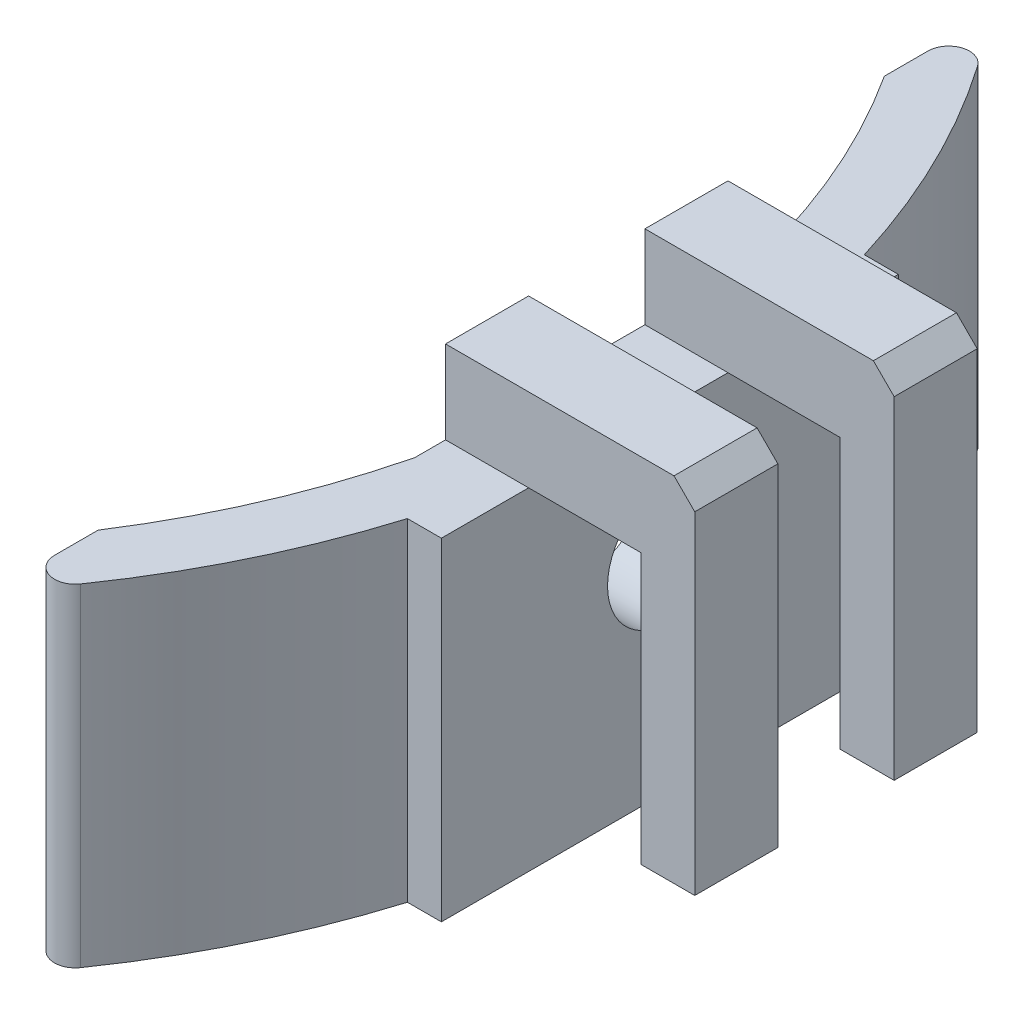
ISO-10303-21;
HEADER;
FILE_DESCRIPTION(('STEP AP214'),'2;1');
FILE_NAME('part.step','',(''),(''),'','','');
FILE_SCHEMA(('AUTOMOTIVE_DESIGN { 1 0 10303 214 1 1 1 1 }'));
ENDSEC;
DATA;
#1=APPLICATION_CONTEXT('core data for automotive mechanical design processes');
#2=APPLICATION_PROTOCOL_DEFINITION('international standard','automotive_design',2000,#1);
#3=PRODUCT_CONTEXT('',#1,'mechanical');
#4=PRODUCT('Part','Part','',(#3));
#5=PRODUCT_RELATED_PRODUCT_CATEGORY('part','',(#4));
#6=PRODUCT_DEFINITION_FORMATION('','',#4);
#7=PRODUCT_DEFINITION_CONTEXT('part definition',#1,'design');
#8=PRODUCT_DEFINITION('design','',#6,#7);
#9=PRODUCT_DEFINITION_SHAPE('','',#8);
#10=(LENGTH_UNIT() NAMED_UNIT(*) SI_UNIT(.MILLI.,.METRE.));
#11=(NAMED_UNIT(*) PLANE_ANGLE_UNIT() SI_UNIT($,.RADIAN.));
#12=(NAMED_UNIT(*) SI_UNIT($,.STERADIAN.) SOLID_ANGLE_UNIT());
#13=UNCERTAINTY_MEASURE_WITH_UNIT(LENGTH_MEASURE(1.E-05),#10,'distance_accuracy_value','');
#14=(GEOMETRIC_REPRESENTATION_CONTEXT(3) GLOBAL_UNCERTAINTY_ASSIGNED_CONTEXT((#13)) GLOBAL_UNIT_ASSIGNED_CONTEXT((#10,
#11,#12)) REPRESENTATION_CONTEXT('',''));
#15=CARTESIAN_POINT('',(0.,0.,0.));
#16=DIRECTION('',(0.,0.,1.));
#17=DIRECTION('',(1.,0.,0.));
#18=AXIS2_PLACEMENT_3D('',#15,#16,#17);
#19=CARTESIAN_POINT('',(2.,-3.,5.5));
#20=DIRECTION('',(0.,0.,-1.));
#21=DIRECTION('',(-1.,0.,0.));
#22=AXIS2_PLACEMENT_3D('',#19,#20,#21);
#23=PLANE('',#22);
#24=DIRECTION('',(0.,-1.,0.));
#25=VECTOR('',#24,1.);
#26=CARTESIAN_POINT('',(1.18177219531319,3.,5.5));
#27=LINE('',#26,#25);
#28=CARTESIAN_POINT('',(1.18177219531319,-5.,5.5));
#29=VERTEX_POINT('',#28);
#30=CARTESIAN_POINT('',(1.18177219531319,3.,5.5));
#31=VERTEX_POINT('',#30);
#32=EDGE_CURVE('E290',#29,#31,#27,.F.);
#33=ORIENTED_EDGE('',*,*,#32,.F.);
#34=DIRECTION('',(-1.,0.,0.));
#35=VECTOR('',#34,1.);
#36=CARTESIAN_POINT('',(2.,-5.,5.5));
#37=LINE('',#36,#35);
#38=CARTESIAN_POINT('',(2.,-5.,5.5));
#39=VERTEX_POINT('',#38);
#40=EDGE_CURVE('E300',#39,#29,#37,.T.);
#41=ORIENTED_EDGE('',*,*,#40,.F.);
#42=DIRECTION('',(0.,-1.,0.));
#43=VECTOR('',#42,1.);
#44=CARTESIAN_POINT('',(2.,-3.,5.5));
#45=LINE('',#44,#43);
#46=CARTESIAN_POINT('',(2.,3.,5.5));
#47=VERTEX_POINT('',#46);
#48=EDGE_CURVE('E376',#47,#39,#45,.T.);
#49=ORIENTED_EDGE('',*,*,#48,.F.);
#50=DIRECTION('',(-1.,0.,0.));
#51=VECTOR('',#50,1.);
#52=CARTESIAN_POINT('',(2.,3.,5.5));
#53=LINE('',#52,#51);
#54=EDGE_CURVE('E409',#47,#31,#53,.T.);
#55=ORIENTED_EDGE('',*,*,#54,.T.);
#56=EDGE_LOOP('',(#33,#41,#49,#55));
#57=FACE_BOUND('',#56,.T.);
#58=ADVANCED_FACE('F37',(#57),#23,.F.);
#59=CARTESIAN_POINT('',(2.,-3.,-5.5));
#60=DIRECTION('',(0.,0.,1.));
#61=DIRECTION('',(1.,0.,0.));
#62=AXIS2_PLACEMENT_3D('',#59,#60,#61);
#63=PLANE('',#62);
#64=DIRECTION('',(0.,-1.,0.));
#65=VECTOR('',#64,1.);
#66=CARTESIAN_POINT('',(1.18177219531319,3.,-5.5));
#67=LINE('',#66,#65);
#68=CARTESIAN_POINT('',(1.18177219531319,3.,-5.5));
#69=VERTEX_POINT('',#68);
#70=CARTESIAN_POINT('',(1.18177219531319,-5.,-5.5));
#71=VERTEX_POINT('',#70);
#72=EDGE_CURVE('E288',#69,#71,#67,.T.);
#73=ORIENTED_EDGE('',*,*,#72,.F.);
#74=DIRECTION('',(-1.,0.,0.));
#75=VECTOR('',#74,1.);
#76=CARTESIAN_POINT('',(2.,3.,-5.5));
#77=LINE('',#76,#75);
#78=CARTESIAN_POINT('',(2.,3.,-5.5));
#79=VERTEX_POINT('',#78);
#80=EDGE_CURVE('E381',#79,#69,#77,.T.);
#81=ORIENTED_EDGE('',*,*,#80,.F.);
#82=DIRECTION('',(0.,1.,0.));
#83=VECTOR('',#82,1.);
#84=CARTESIAN_POINT('',(2.,-3.,-5.5));
#85=LINE('',#84,#83);
#86=CARTESIAN_POINT('',(2.,-5.,-5.5));
#87=VERTEX_POINT('',#86);
#88=EDGE_CURVE('E379',#87,#79,#85,.T.);
#89=ORIENTED_EDGE('',*,*,#88,.F.);
#90=DIRECTION('',(1.,0.,0.));
#91=VECTOR('',#90,1.);
#92=CARTESIAN_POINT('',(0.,-5.,-5.5));
#93=LINE('',#92,#91);
#94=EDGE_CURVE('E305',#71,#87,#93,.T.);
#95=ORIENTED_EDGE('',*,*,#94,.F.);
#96=EDGE_LOOP('',(#73,#81,#89,#95));
#97=FACE_BOUND('',#96,.T.);
#98=ADVANCED_FACE('F484',(#97),#63,.F.);
#99=CARTESIAN_POINT('',(6.,3.,-1.4));
#100=DIRECTION('',(0.,1.,0.));
#101=DIRECTION('',(0.,0.,1.));
#102=AXIS2_PLACEMENT_3D('',#99,#100,#101);
#103=PLANE('',#102);
#104=DIRECTION('',(0.,0.,-1.));
#105=VECTOR('',#104,1.);
#106=CARTESIAN_POINT('',(4.7,3.,-1.4));
#107=LINE('',#106,#105);
#108=CARTESIAN_POINT('',(4.7,3.,-1.4));
#109=VERTEX_POINT('',#108);
#110=CARTESIAN_POINT('',(4.7,3.,-3.4));
#111=VERTEX_POINT('',#110);
#112=EDGE_CURVE('E307',#109,#111,#107,.T.);
#113=ORIENTED_EDGE('',*,*,#112,.F.);
#114=DIRECTION('',(-1.,0.,0.));
#115=VECTOR('',#114,1.);
#116=CARTESIAN_POINT('',(6.,3.,-1.4));
#117=LINE('',#116,#115);
#118=CARTESIAN_POINT('',(2.,3.,-1.4));
#119=VERTEX_POINT('',#118);
#120=EDGE_CURVE('E365',#109,#119,#117,.T.);
#121=ORIENTED_EDGE('',*,*,#120,.T.);
#122=DIRECTION('',(0.,0.,-1.));
#123=VECTOR('',#122,1.);
#124=CARTESIAN_POINT('',(2.,3.,-1.4));
#125=LINE('',#124,#123);
#126=CARTESIAN_POINT('',(2.,3.,-3.4));
#127=VERTEX_POINT('',#126);
#128=EDGE_CURVE('E355',#119,#127,#125,.T.);
#129=ORIENTED_EDGE('',*,*,#128,.T.);
#130=DIRECTION('',(-1.,0.,0.));
#131=VECTOR('',#130,1.);
#132=CARTESIAN_POINT('',(6.,3.,-3.4));
#133=LINE('',#132,#131);
#134=EDGE_CURVE('E361',#111,#127,#133,.T.);
#135=ORIENTED_EDGE('',*,*,#134,.F.);
#136=EDGE_LOOP('',(#113,#121,#129,#135));
#137=FACE_BOUND('',#136,.T.);
#138=ADVANCED_FACE('F481',(#137),#103,.F.);
#139=CARTESIAN_POINT('',(6.,3.,3.4));
#140=DIRECTION('',(0.,1.,0.));
#141=DIRECTION('',(0.,0.,1.));
#142=AXIS2_PLACEMENT_3D('',#139,#140,#141);
#143=PLANE('',#142);
#144=DIRECTION('',(0.,0.,-1.));
#145=VECTOR('',#144,1.);
#146=CARTESIAN_POINT('',(4.7,3.,3.4));
#147=LINE('',#146,#145);
#148=CARTESIAN_POINT('',(4.7,3.,3.4));
#149=VERTEX_POINT('',#148);
#150=CARTESIAN_POINT('',(4.7,3.,1.4));
#151=VERTEX_POINT('',#150);
#152=EDGE_CURVE('E325',#149,#151,#147,.T.);
#153=ORIENTED_EDGE('',*,*,#152,.F.);
#154=DIRECTION('',(-1.,0.,0.));
#155=VECTOR('',#154,1.);
#156=CARTESIAN_POINT('',(6.,3.,3.4));
#157=LINE('',#156,#155);
#158=CARTESIAN_POINT('',(2.,3.,3.4));
#159=VERTEX_POINT('',#158);
#160=EDGE_CURVE('E353',#149,#159,#157,.T.);
#161=ORIENTED_EDGE('',*,*,#160,.T.);
#162=DIRECTION('',(0.,0.,-1.));
#163=VECTOR('',#162,1.);
#164=CARTESIAN_POINT('',(2.,3.,3.4));
#165=LINE('',#164,#163);
#166=CARTESIAN_POINT('',(2.,3.,1.4));
#167=VERTEX_POINT('',#166);
#168=EDGE_CURVE('E342',#159,#167,#165,.T.);
#169=ORIENTED_EDGE('',*,*,#168,.T.);
#170=DIRECTION('',(-1.,0.,0.));
#171=VECTOR('',#170,1.);
#172=CARTESIAN_POINT('',(6.,3.,1.4));
#173=LINE('',#172,#171);
#174=EDGE_CURVE('E348',#151,#167,#173,.T.);
#175=ORIENTED_EDGE('',*,*,#174,.F.);
#176=EDGE_LOOP('',(#153,#161,#169,#175));
#177=FACE_BOUND('',#176,.T.);
#178=ADVANCED_FACE('F483',(#177),#143,.F.);
#179=CARTESIAN_POINT('',(2.,0.,0.));
#180=DIRECTION('',(1.,0.,0.));
#181=DIRECTION('',(0.,0.,-1.));
#182=AXIS2_PLACEMENT_3D('',#179,#180,#181);
#183=PLANE('',#182);
#184=CARTESIAN_POINT('',(2.,0.,0.));
#185=DIRECTION('',(-1.,0.,0.));
#186=DIRECTION('',(0.,0.,1.));
#187=AXIS2_PLACEMENT_3D('',#184,#185,#186);
#188=CIRCLE('',#187,1.5);
#189=CARTESIAN_POINT('',(2.,0.,1.5));
#190=VERTEX_POINT('',#189);
#191=EDGE_CURVE('E293',#190,#190,#188,.T.);
#192=ORIENTED_EDGE('',*,*,#191,.T.);
#193=EDGE_LOOP('',(#192));
#194=FACE_BOUND('',#193,.T.);
#195=ORIENTED_EDGE('',*,*,#48,.T.);
#196=DIRECTION('',(0.,0.,1.));
#197=VECTOR('',#196,1.);
#198=CARTESIAN_POINT('',(2.,-5.,-5.5));
#199=LINE('',#198,#197);
#200=EDGE_CURVE('E296',#87,#39,#199,.T.);
#201=ORIENTED_EDGE('',*,*,#200,.F.);
#202=ORIENTED_EDGE('',*,*,#88,.T.);
#203=DIRECTION('',(0.,0.,1.));
#204=VECTOR('',#203,1.);
#205=CARTESIAN_POINT('',(2.,3.,-3.4));
#206=LINE('',#205,#204);
#207=EDGE_CURVE('E368',#79,#127,#206,.T.);
#208=ORIENTED_EDGE('',*,*,#207,.T.);
#209=ORIENTED_EDGE('',*,*,#128,.F.);
#210=DIRECTION('',(0.,0.,1.));
#211=VECTOR('',#210,1.);
#212=CARTESIAN_POINT('',(2.,3.,1.4));
#213=LINE('',#212,#211);
#214=EDGE_CURVE('E371',#119,#167,#213,.T.);
#215=ORIENTED_EDGE('',*,*,#214,.T.);
#216=ORIENTED_EDGE('',*,*,#168,.F.);
#217=DIRECTION('',(0.,0.,1.));
#218=VECTOR('',#217,1.);
#219=CARTESIAN_POINT('',(2.,3.,5.5));
#220=LINE('',#219,#218);
#221=EDGE_CURVE('E374',#159,#47,#220,.T.);
#222=ORIENTED_EDGE('',*,*,#221,.T.);
#223=EDGE_LOOP('',(#195,#201,#202,#208,#209,#215,#216,#222));
#224=FACE_BOUND('',#223,.T.);
#225=ADVANCED_FACE('F477',(#194,#224),#183,.T.);
#226=CARTESIAN_POINT('',(2.,3.,-3.4));
#227=DIRECTION('',(0.,-1.,0.));
#228=DIRECTION('',(0.,0.,-1.));
#229=AXIS2_PLACEMENT_3D('',#226,#227,#228);
#230=PLANE('',#229);
#231=ORIENTED_EDGE('',*,*,#80,.T.);
#232=CARTESIAN_POINT('',(-16.8941860465116,3.,0.));
#233=DIRECTION('',(0.,1.,0.));
#234=DIRECTION('',(0.,0.,1.));
#235=AXIS2_PLACEMENT_3D('',#232,#233,#234);
#236=CIRCLE('',#235,18.8941860465116);
#237=CARTESIAN_POINT('',(-1.38970225677982,3.,-10.7982058127329));
#238=VERTEX_POINT('',#237);
#239=EDGE_CURVE('E267',#69,#238,#236,.T.);
#240=ORIENTED_EDGE('',*,*,#239,.T.);
#241=CARTESIAN_POINT('',(-1.8,3.,-10.5124510893976));
#242=DIRECTION('',(0.,1.,0.));
#243=DIRECTION('',(0.,0.,1.));
#244=AXIS2_PLACEMENT_3D('',#241,#242,#243);
#245=CIRCLE('',#244,0.5);
#246=CARTESIAN_POINT('',(-2.3,3.,-10.5124510893976));
#247=VERTEX_POINT('',#246);
#248=EDGE_CURVE('E265',#238,#247,#245,.T.);
#249=ORIENTED_EDGE('',*,*,#248,.T.);
#250=DIRECTION('',(0.,0.,-1.));
#251=VECTOR('',#250,1.);
#252=CARTESIAN_POINT('',(-2.3,3.,-9.46400770606539));
#253=LINE('',#252,#251);
#254=CARTESIAN_POINT('',(-2.3,3.,-9.46400770606539));
#255=VERTEX_POINT('',#254);
#256=EDGE_CURVE('E262',#255,#247,#253,.T.);
#257=ORIENTED_EDGE('',*,*,#256,.F.);
#258=CARTESIAN_POINT('',(-16.8941860465116,3.,0.));
#259=DIRECTION('',(0.,1.,0.));
#260=DIRECTION('',(0.,0.,1.));
#261=AXIS2_PLACEMENT_3D('',#258,#259,#260);
#262=CIRCLE('',#261,17.3941860465116);
#263=CARTESIAN_POINT('',(0.,3.,-4.14055383330679));
#264=VERTEX_POINT('',#263);
#265=EDGE_CURVE('E259',#264,#255,#262,.T.);
#266=ORIENTED_EDGE('',*,*,#265,.F.);
#267=DIRECTION('',(0.,0.,1.));
#268=VECTOR('',#267,1.);
#269=CARTESIAN_POINT('',(0.,3.,-3.4));
#270=LINE('',#269,#268);
#271=CARTESIAN_POINT('',(0.,3.,-3.4));
#272=VERTEX_POINT('',#271);
#273=EDGE_CURVE('E367',#264,#272,#270,.T.);
#274=ORIENTED_EDGE('',*,*,#273,.T.);
#275=DIRECTION('',(-1.,0.,0.));
#276=VECTOR('',#275,1.);
#277=CARTESIAN_POINT('',(2.,3.,-3.4));
#278=LINE('',#277,#276);
#279=EDGE_CURVE('E426',#127,#272,#278,.T.);
#280=ORIENTED_EDGE('',*,*,#279,.F.);
#281=ORIENTED_EDGE('',*,*,#207,.F.);
#282=EDGE_LOOP('',(#231,#240,#249,#257,#266,#274,#280,#281));
#283=FACE_BOUND('',#282,.T.);
#284=ADVANCED_FACE('F471',(#283),#230,.F.);
#285=CARTESIAN_POINT('',(2.,3.,-3.4));
#286=DIRECTION('',(0.,0.,1.));
#287=DIRECTION('',(1.,0.,0.));
#288=AXIS2_PLACEMENT_3D('',#285,#286,#287);
#289=PLANE('',#288);
#290=DIRECTION('',(-1.,0.,0.));
#291=VECTOR('',#290,1.);
#292=CARTESIAN_POINT('',(2.,5.,-3.4));
#293=LINE('',#292,#291);
#294=CARTESIAN_POINT('',(5.5,5.,-3.4));
#295=VERTEX_POINT('',#294);
#296=CARTESIAN_POINT('',(0.,5.,-3.4));
#297=VERTEX_POINT('',#296);
#298=EDGE_CURVE('E424',#295,#297,#293,.T.);
#299=ORIENTED_EDGE('',*,*,#298,.F.);
#300=DIRECTION('',(0.707106781186549,-0.707106781186546,0.));
#301=VECTOR('',#300,1.);
#302=CARTESIAN_POINT('',(6.,4.5,-3.4));
#303=LINE('',#302,#301);
#304=CARTESIAN_POINT('',(6.,4.5,-3.4));
#305=VERTEX_POINT('',#304);
#306=EDGE_CURVE('E11',#295,#305,#303,.T.);
#307=ORIENTED_EDGE('',*,*,#306,.T.);
#308=DIRECTION('',(0.,1.,0.));
#309=VECTOR('',#308,1.);
#310=CARTESIAN_POINT('',(6.,3.,-3.4));
#311=LINE('',#310,#309);
#312=CARTESIAN_POINT('',(6.,-3.5,-3.4));
#313=VERTEX_POINT('',#312);
#314=EDGE_CURVE('E356',#313,#305,#311,.T.);
#315=ORIENTED_EDGE('',*,*,#314,.F.);
#316=DIRECTION('',(1.,0.,0.));
#317=VECTOR('',#316,1.);
#318=CARTESIAN_POINT('',(6.,-3.5,-3.4));
#319=LINE('',#318,#317);
#320=CARTESIAN_POINT('',(4.7,-3.5,-3.4));
#321=VERTEX_POINT('',#320);
#322=EDGE_CURVE('E311',#321,#313,#319,.T.);
#323=ORIENTED_EDGE('',*,*,#322,.F.);
#324=DIRECTION('',(0.,1.,0.));
#325=VECTOR('',#324,1.);
#326=CARTESIAN_POINT('',(4.7,-3.5,-3.4));
#327=LINE('',#326,#325);
#328=EDGE_CURVE('E323',#321,#111,#327,.T.);
#329=ORIENTED_EDGE('',*,*,#328,.T.);
#330=ORIENTED_EDGE('',*,*,#134,.T.);
#331=ORIENTED_EDGE('',*,*,#279,.T.);
#332=DIRECTION('',(0.,1.,0.));
#333=VECTOR('',#332,1.);
#334=CARTESIAN_POINT('',(0.,3.,-3.4));
#335=LINE('',#334,#333);
#336=EDGE_CURVE('E384',#272,#297,#335,.T.);
#337=ORIENTED_EDGE('',*,*,#336,.T.);
#338=EDGE_LOOP('',(#299,#307,#315,#323,#329,#330,#331,#337));
#339=FACE_BOUND('',#338,.T.);
#340=ADVANCED_FACE('F452',(#339),#289,.F.);
#341=CARTESIAN_POINT('',(2.,5.,-1.4));
#342=DIRECTION('',(0.,-1.,0.));
#343=DIRECTION('',(0.,0.,-1.));
#344=AXIS2_PLACEMENT_3D('',#341,#342,#343);
#345=PLANE('',#344);
#346=DIRECTION('',(-1.,0.,0.));
#347=VECTOR('',#346,1.);
#348=CARTESIAN_POINT('',(2.,5.,-1.4));
#349=LINE('',#348,#347);
#350=CARTESIAN_POINT('',(5.5,5.,-1.4));
#351=VERTEX_POINT('',#350);
#352=CARTESIAN_POINT('',(0.,5.,-1.4));
#353=VERTEX_POINT('',#352);
#354=EDGE_CURVE('E422',#351,#353,#349,.T.);
#355=ORIENTED_EDGE('',*,*,#354,.F.);
#356=DIRECTION('',(0.,0.,-1.));
#357=VECTOR('',#356,1.);
#358=CARTESIAN_POINT('',(5.5,5.,-3.4));
#359=LINE('',#358,#357);
#360=EDGE_CURVE('E46',#351,#295,#359,.T.);
#361=ORIENTED_EDGE('',*,*,#360,.T.);
#362=ORIENTED_EDGE('',*,*,#298,.T.);
#363=DIRECTION('',(0.,0.,1.));
#364=VECTOR('',#363,1.);
#365=CARTESIAN_POINT('',(0.,5.,-1.4));
#366=LINE('',#365,#364);
#367=EDGE_CURVE('E387',#297,#353,#366,.T.);
#368=ORIENTED_EDGE('',*,*,#367,.T.);
#369=EDGE_LOOP('',(#355,#361,#362,#368));
#370=FACE_BOUND('',#369,.T.);
#371=ADVANCED_FACE('F447',(#370),#345,.F.);
#372=CARTESIAN_POINT('',(2.,3.,-1.4));
#373=DIRECTION('',(0.,0.,-1.));
#374=DIRECTION('',(0.,1.,0.));
#375=AXIS2_PLACEMENT_3D('',#372,#373,#374);
#376=PLANE('',#375);
#377=DIRECTION('',(0.,-1.,0.));
#378=VECTOR('',#377,1.);
#379=CARTESIAN_POINT('',(6.,5.,-1.4));
#380=LINE('',#379,#378);
#381=CARTESIAN_POINT('',(6.,4.5,-1.4));
#382=VERTEX_POINT('',#381);
#383=CARTESIAN_POINT('',(6.,-3.5,-1.4));
#384=VERTEX_POINT('',#383);
#385=EDGE_CURVE('E359',#382,#384,#380,.T.);
#386=ORIENTED_EDGE('',*,*,#385,.F.);
#387=DIRECTION('',(-0.707106781186549,0.707106781186546,0.));
#388=VECTOR('',#387,1.);
#389=CARTESIAN_POINT('',(6.,4.5,-1.4));
#390=LINE('',#389,#388);
#391=EDGE_CURVE('E440',#382,#351,#390,.T.);
#392=ORIENTED_EDGE('',*,*,#391,.T.);
#393=ORIENTED_EDGE('',*,*,#354,.T.);
#394=DIRECTION('',(0.,-1.,0.));
#395=VECTOR('',#394,1.);
#396=CARTESIAN_POINT('',(0.,3.,-1.4));
#397=LINE('',#396,#395);
#398=CARTESIAN_POINT('',(0.,3.,-1.4));
#399=VERTEX_POINT('',#398);
#400=EDGE_CURVE('E390',#353,#399,#397,.T.);
#401=ORIENTED_EDGE('',*,*,#400,.T.);
#402=DIRECTION('',(-1.,0.,0.));
#403=VECTOR('',#402,1.);
#404=CARTESIAN_POINT('',(2.,3.,-1.4));
#405=LINE('',#404,#403);
#406=EDGE_CURVE('E420',#119,#399,#405,.T.);
#407=ORIENTED_EDGE('',*,*,#406,.F.);
#408=ORIENTED_EDGE('',*,*,#120,.F.);
#409=DIRECTION('',(0.,1.,0.));
#410=VECTOR('',#409,1.);
#411=CARTESIAN_POINT('',(4.7,-3.5,-1.4));
#412=LINE('',#411,#410);
#413=CARTESIAN_POINT('',(4.7,-3.5,-1.4));
#414=VERTEX_POINT('',#413);
#415=EDGE_CURVE('E319',#414,#109,#412,.T.);
#416=ORIENTED_EDGE('',*,*,#415,.F.);
#417=DIRECTION('',(-1.,0.,0.));
#418=VECTOR('',#417,1.);
#419=CARTESIAN_POINT('',(6.,-3.5,-1.4));
#420=LINE('',#419,#418);
#421=EDGE_CURVE('E317',#384,#414,#420,.T.);
#422=ORIENTED_EDGE('',*,*,#421,.F.);
#423=EDGE_LOOP('',(#386,#392,#393,#401,#407,#408,#416,#422));
#424=FACE_BOUND('',#423,.T.);
#425=ADVANCED_FACE('F443',(#424),#376,.F.);
#426=CARTESIAN_POINT('',(2.,3.,1.4));
#427=DIRECTION('',(0.,-1.,0.));
#428=DIRECTION('',(0.,0.,-1.));
#429=AXIS2_PLACEMENT_3D('',#426,#427,#428);
#430=PLANE('',#429);
#431=ORIENTED_EDGE('',*,*,#406,.T.);
#432=DIRECTION('',(0.,0.,1.));
#433=VECTOR('',#432,1.);
#434=CARTESIAN_POINT('',(0.,3.,1.4));
#435=LINE('',#434,#433);
#436=CARTESIAN_POINT('',(0.,3.,1.4));
#437=VERTEX_POINT('',#436);
#438=EDGE_CURVE('E393',#399,#437,#435,.T.);
#439=ORIENTED_EDGE('',*,*,#438,.T.);
#440=DIRECTION('',(-1.,0.,0.));
#441=VECTOR('',#440,1.);
#442=CARTESIAN_POINT('',(2.,3.,1.4));
#443=LINE('',#442,#441);
#444=EDGE_CURVE('E418',#167,#437,#443,.T.);
#445=ORIENTED_EDGE('',*,*,#444,.F.);
#446=ORIENTED_EDGE('',*,*,#214,.F.);
#447=EDGE_LOOP('',(#431,#439,#445,#446));
#448=FACE_BOUND('',#447,.T.);
#449=ADVANCED_FACE('F520',(#448),#430,.F.);
#450=CARTESIAN_POINT('',(2.,3.,1.4));
#451=DIRECTION('',(0.,0.,1.));
#452=DIRECTION('',(0.,-1.,0.));
#453=AXIS2_PLACEMENT_3D('',#450,#451,#452);
#454=PLANE('',#453);
#455=DIRECTION('',(-1.,0.,0.));
#456=VECTOR('',#455,1.);
#457=CARTESIAN_POINT('',(2.,5.,1.4));
#458=LINE('',#457,#456);
#459=CARTESIAN_POINT('',(5.5,5.,1.4));
#460=VERTEX_POINT('',#459);
#461=CARTESIAN_POINT('',(0.,5.,1.4));
#462=VERTEX_POINT('',#461);
#463=EDGE_CURVE('E416',#460,#462,#458,.T.);
#464=ORIENTED_EDGE('',*,*,#463,.F.);
#465=DIRECTION('',(0.707106781186549,-0.707106781186546,0.));
#466=VECTOR('',#465,1.);
#467=CARTESIAN_POINT('',(6.,4.5,1.4));
#468=LINE('',#467,#466);
#469=CARTESIAN_POINT('',(6.,4.5,1.4));
#470=VERTEX_POINT('',#469);
#471=EDGE_CURVE('E435',#460,#470,#468,.T.);
#472=ORIENTED_EDGE('',*,*,#471,.T.);
#473=DIRECTION('',(0.,1.,0.));
#474=VECTOR('',#473,1.);
#475=CARTESIAN_POINT('',(6.,3.,1.4));
#476=LINE('',#475,#474);
#477=CARTESIAN_POINT('',(6.,-3.5,1.4));
#478=VERTEX_POINT('',#477);
#479=EDGE_CURVE('E343',#478,#470,#476,.T.);
#480=ORIENTED_EDGE('',*,*,#479,.F.);
#481=DIRECTION('',(1.,0.,0.));
#482=VECTOR('',#481,1.);
#483=CARTESIAN_POINT('',(6.,-3.5,1.4));
#484=LINE('',#483,#482);
#485=CARTESIAN_POINT('',(4.7,-3.5,1.4));
#486=VERTEX_POINT('',#485);
#487=EDGE_CURVE('E333',#486,#478,#484,.T.);
#488=ORIENTED_EDGE('',*,*,#487,.F.);
#489=DIRECTION('',(0.,1.,0.));
#490=VECTOR('',#489,1.);
#491=CARTESIAN_POINT('',(4.7,-3.5,1.4));
#492=LINE('',#491,#490);
#493=EDGE_CURVE('E336',#486,#151,#492,.T.);
#494=ORIENTED_EDGE('',*,*,#493,.T.);
#495=ORIENTED_EDGE('',*,*,#174,.T.);
#496=ORIENTED_EDGE('',*,*,#444,.T.);
#497=DIRECTION('',(0.,1.,0.));
#498=VECTOR('',#497,1.);
#499=CARTESIAN_POINT('',(0.,3.,1.4));
#500=LINE('',#499,#498);
#501=EDGE_CURVE('E396',#437,#462,#500,.T.);
#502=ORIENTED_EDGE('',*,*,#501,.T.);
#503=EDGE_LOOP('',(#464,#472,#480,#488,#494,#495,#496,#502));
#504=FACE_BOUND('',#503,.T.);
#505=ADVANCED_FACE('F516',(#504),#454,.F.);
#506=CARTESIAN_POINT('',(2.,5.,1.4));
#507=DIRECTION('',(0.,-1.,0.));
#508=DIRECTION('',(0.,0.,-1.));
#509=AXIS2_PLACEMENT_3D('',#506,#507,#508);
#510=PLANE('',#509);
#511=DIRECTION('',(-1.,0.,0.));
#512=VECTOR('',#511,1.);
#513=CARTESIAN_POINT('',(2.,5.,3.4));
#514=LINE('',#513,#512);
#515=CARTESIAN_POINT('',(5.5,5.,3.4));
#516=VERTEX_POINT('',#515);
#517=CARTESIAN_POINT('',(0.,5.,3.4));
#518=VERTEX_POINT('',#517);
#519=EDGE_CURVE('E414',#516,#518,#514,.T.);
#520=ORIENTED_EDGE('',*,*,#519,.F.);
#521=DIRECTION('',(0.,0.,-1.));
#522=VECTOR('',#521,1.);
#523=CARTESIAN_POINT('',(5.5,5.,1.4));
#524=LINE('',#523,#522);
#525=EDGE_CURVE('E433',#516,#460,#524,.T.);
#526=ORIENTED_EDGE('',*,*,#525,.T.);
#527=ORIENTED_EDGE('',*,*,#463,.T.);
#528=DIRECTION('',(0.,0.,1.));
#529=VECTOR('',#528,1.);
#530=CARTESIAN_POINT('',(0.,5.,1.4));
#531=LINE('',#530,#529);
#532=EDGE_CURVE('E399',#462,#518,#531,.T.);
#533=ORIENTED_EDGE('',*,*,#532,.T.);
#534=EDGE_LOOP('',(#520,#526,#527,#533));
#535=FACE_BOUND('',#534,.T.);
#536=ADVANCED_FACE('F512',(#535),#510,.F.);
#537=CARTESIAN_POINT('',(2.,3.,3.4));
#538=DIRECTION('',(0.,0.,-1.));
#539=DIRECTION('',(-1.,0.,0.));
#540=AXIS2_PLACEMENT_3D('',#537,#538,#539);
#541=PLANE('',#540);
#542=DIRECTION('',(0.,-1.,0.));
#543=VECTOR('',#542,1.);
#544=CARTESIAN_POINT('',(6.,5.,3.4));
#545=LINE('',#544,#543);
#546=CARTESIAN_POINT('',(6.,4.5,3.4));
#547=VERTEX_POINT('',#546);
#548=CARTESIAN_POINT('',(6.,-3.5,3.4));
#549=VERTEX_POINT('',#548);
#550=EDGE_CURVE('E346',#547,#549,#545,.T.);
#551=ORIENTED_EDGE('',*,*,#550,.F.);
#552=DIRECTION('',(-0.707106781186549,0.707106781186546,0.));
#553=VECTOR('',#552,1.);
#554=CARTESIAN_POINT('',(6.,4.5,3.4));
#555=LINE('',#554,#553);
#556=EDGE_CURVE('E431',#547,#516,#555,.T.);
#557=ORIENTED_EDGE('',*,*,#556,.T.);
#558=ORIENTED_EDGE('',*,*,#519,.T.);
#559=DIRECTION('',(0.,-1.,0.));
#560=VECTOR('',#559,1.);
#561=CARTESIAN_POINT('',(0.,3.,3.4));
#562=LINE('',#561,#560);
#563=CARTESIAN_POINT('',(0.,3.,3.4));
#564=VERTEX_POINT('',#563);
#565=EDGE_CURVE('E402',#518,#564,#562,.T.);
#566=ORIENTED_EDGE('',*,*,#565,.T.);
#567=DIRECTION('',(-1.,0.,0.));
#568=VECTOR('',#567,1.);
#569=CARTESIAN_POINT('',(2.,3.,3.4));
#570=LINE('',#569,#568);
#571=EDGE_CURVE('E412',#159,#564,#570,.T.);
#572=ORIENTED_EDGE('',*,*,#571,.F.);
#573=ORIENTED_EDGE('',*,*,#160,.F.);
#574=DIRECTION('',(0.,1.,0.));
#575=VECTOR('',#574,1.);
#576=CARTESIAN_POINT('',(4.7,-3.5,3.4));
#577=LINE('',#576,#575);
#578=CARTESIAN_POINT('',(4.7,-3.5,3.4));
#579=VERTEX_POINT('',#578);
#580=EDGE_CURVE('E340',#579,#149,#577,.T.);
#581=ORIENTED_EDGE('',*,*,#580,.F.);
#582=DIRECTION('',(-1.,0.,0.));
#583=VECTOR('',#582,1.);
#584=CARTESIAN_POINT('',(6.,-3.5,3.4));
#585=LINE('',#584,#583);
#586=EDGE_CURVE('E329',#549,#579,#585,.T.);
#587=ORIENTED_EDGE('',*,*,#586,.F.);
#588=EDGE_LOOP('',(#551,#557,#558,#566,#572,#573,#581,#587));
#589=FACE_BOUND('',#588,.T.);
#590=ADVANCED_FACE('F508',(#589),#541,.F.);
#591=CARTESIAN_POINT('',(2.,3.,5.5));
#592=DIRECTION('',(0.,-1.,0.));
#593=DIRECTION('',(0.,0.,-1.));
#594=AXIS2_PLACEMENT_3D('',#591,#592,#593);
#595=PLANE('',#594);
#596=ORIENTED_EDGE('',*,*,#571,.T.);
#597=DIRECTION('',(0.,0.,1.));
#598=VECTOR('',#597,1.);
#599=CARTESIAN_POINT('',(0.,3.,5.5));
#600=LINE('',#599,#598);
#601=CARTESIAN_POINT('',(0.,3.,4.14055383330678));
#602=VERTEX_POINT('',#601);
#603=EDGE_CURVE('E372',#564,#602,#600,.T.);
#604=ORIENTED_EDGE('',*,*,#603,.T.);
#605=CARTESIAN_POINT('',(-2.3,3.,9.46400770606539));
#606=VERTEX_POINT('',#605);
#607=EDGE_CURVE('E260',#606,#602,#262,.T.);
#608=ORIENTED_EDGE('',*,*,#607,.F.);
#609=DIRECTION('',(0.,0.,-1.));
#610=VECTOR('',#609,1.);
#611=CARTESIAN_POINT('',(-2.3,3.,10.5124510893976));
#612=LINE('',#611,#610);
#613=CARTESIAN_POINT('',(-2.3,3.,10.5124510893976));
#614=VERTEX_POINT('',#613);
#615=EDGE_CURVE('E228',#614,#606,#612,.T.);
#616=ORIENTED_EDGE('',*,*,#615,.F.);
#617=CARTESIAN_POINT('',(-1.8,3.,10.5124510893976));
#618=DIRECTION('',(0.,-1.,0.));
#619=DIRECTION('',(0.,0.,-1.));
#620=AXIS2_PLACEMENT_3D('',#617,#618,#619);
#621=CIRCLE('',#620,0.5);
#622=CARTESIAN_POINT('',(-1.38970225677982,3.,10.7982058127329));
#623=VERTEX_POINT('',#622);
#624=EDGE_CURVE('E232',#623,#614,#621,.T.);
#625=ORIENTED_EDGE('',*,*,#624,.F.);
#626=EDGE_CURVE('E268',#623,#31,#236,.T.);
#627=ORIENTED_EDGE('',*,*,#626,.T.);
#628=ORIENTED_EDGE('',*,*,#54,.F.);
#629=ORIENTED_EDGE('',*,*,#221,.F.);
#630=EDGE_LOOP('',(#596,#604,#608,#616,#625,#627,#628,#629));
#631=FACE_BOUND('',#630,.T.);
#632=ADVANCED_FACE('F504',(#631),#595,.F.);
#633=CARTESIAN_POINT('',(0.,0.,0.));
#634=DIRECTION('',(1.,0.,0.));
#635=DIRECTION('',(0.,0.,-1.));
#636=AXIS2_PLACEMENT_3D('',#633,#634,#635);
#637=PLANE('',#636);
#638=CARTESIAN_POINT('',(0.,0.,0.));
#639=DIRECTION('',(-1.,0.,0.));
#640=DIRECTION('',(0.,0.,1.));
#641=AXIS2_PLACEMENT_3D('',#638,#639,#640);
#642=CIRCLE('',#641,1.5);
#643=CARTESIAN_POINT('',(0.,0.,1.5));
#644=VERTEX_POINT('',#643);
#645=EDGE_CURVE('E292',#644,#644,#642,.T.);
#646=ORIENTED_EDGE('',*,*,#645,.F.);
#647=EDGE_LOOP('',(#646));
#648=FACE_BOUND('',#647,.T.);
#649=DIRECTION('',(0.,0.,-1.));
#650=VECTOR('',#649,1.);
#651=CARTESIAN_POINT('',(0.,-5.,5.5));
#652=LINE('',#651,#650);
#653=CARTESIAN_POINT('',(0.,-5.,4.14055383330678));
#654=VERTEX_POINT('',#653);
#655=CARTESIAN_POINT('',(0.,-5.,-4.14055383330679));
#656=VERTEX_POINT('',#655);
#657=EDGE_CURVE('E303',#654,#656,#652,.T.);
#658=ORIENTED_EDGE('',*,*,#657,.F.);
#659=DIRECTION('',(0.,-1.,0.));
#660=VECTOR('',#659,1.);
#661=CARTESIAN_POINT('',(0.,3.,4.14055383330678));
#662=LINE('',#661,#660);
#663=EDGE_CURVE('E236',#654,#602,#662,.F.);
#664=ORIENTED_EDGE('',*,*,#663,.T.);
#665=ORIENTED_EDGE('',*,*,#603,.F.);
#666=ORIENTED_EDGE('',*,*,#565,.F.);
#667=ORIENTED_EDGE('',*,*,#532,.F.);
#668=ORIENTED_EDGE('',*,*,#501,.F.);
#669=ORIENTED_EDGE('',*,*,#438,.F.);
#670=ORIENTED_EDGE('',*,*,#400,.F.);
#671=ORIENTED_EDGE('',*,*,#367,.F.);
#672=ORIENTED_EDGE('',*,*,#336,.F.);
#673=ORIENTED_EDGE('',*,*,#273,.F.);
#674=DIRECTION('',(0.,-1.,0.));
#675=VECTOR('',#674,1.);
#676=CARTESIAN_POINT('',(0.,3.,-4.14055383330679));
#677=LINE('',#676,#675);
#678=EDGE_CURVE('E275',#264,#656,#677,.T.);
#679=ORIENTED_EDGE('',*,*,#678,.T.);
#680=EDGE_LOOP('',(#658,#664,#665,#666,#667,#668,#669,#670,#671,#672,#673,#679));
#681=FACE_BOUND('',#680,.T.);
#682=ADVANCED_FACE('F507',(#648,#681),#637,.F.);
#683=CARTESIAN_POINT('',(6.,0.,0.));
#684=DIRECTION('',(1.,0.,0.));
#685=DIRECTION('',(0.,0.,-1.));
#686=AXIS2_PLACEMENT_3D('',#683,#684,#685);
#687=PLANE('',#686);
#688=ORIENTED_EDGE('',*,*,#314,.T.);
#689=DIRECTION('',(0.,0.,1.));
#690=VECTOR('',#689,1.);
#691=CARTESIAN_POINT('',(6.,4.5,-1.4));
#692=LINE('',#691,#690);
#693=EDGE_CURVE('E437',#305,#382,#692,.T.);
#694=ORIENTED_EDGE('',*,*,#693,.T.);
#695=ORIENTED_EDGE('',*,*,#385,.T.);
#696=DIRECTION('',(0.,0.,1.));
#697=VECTOR('',#696,1.);
#698=CARTESIAN_POINT('',(6.,-3.5,-1.4));
#699=LINE('',#698,#697);
#700=EDGE_CURVE('E314',#313,#384,#699,.T.);
#701=ORIENTED_EDGE('',*,*,#700,.F.);
#702=EDGE_LOOP('',(#688,#694,#695,#701));
#703=FACE_BOUND('',#702,.T.);
#704=ADVANCED_FACE('F455',(#703),#687,.T.);
#705=CARTESIAN_POINT('',(6.,0.,0.));
#706=DIRECTION('',(1.,0.,0.));
#707=DIRECTION('',(0.,0.,-1.));
#708=AXIS2_PLACEMENT_3D('',#705,#706,#707);
#709=PLANE('',#708);
#710=ORIENTED_EDGE('',*,*,#479,.T.);
#711=DIRECTION('',(0.,0.,1.));
#712=VECTOR('',#711,1.);
#713=CARTESIAN_POINT('',(6.,4.5,3.4));
#714=LINE('',#713,#712);
#715=EDGE_CURVE('E428',#470,#547,#714,.T.);
#716=ORIENTED_EDGE('',*,*,#715,.T.);
#717=ORIENTED_EDGE('',*,*,#550,.T.);
#718=DIRECTION('',(0.,0.,1.));
#719=VECTOR('',#718,1.);
#720=CARTESIAN_POINT('',(6.,-3.5,3.4));
#721=LINE('',#720,#719);
#722=EDGE_CURVE('E326',#478,#549,#721,.T.);
#723=ORIENTED_EDGE('',*,*,#722,.F.);
#724=EDGE_LOOP('',(#710,#716,#717,#723));
#725=FACE_BOUND('',#724,.T.);
#726=ADVANCED_FACE('F551',(#725),#709,.T.);
#727=CARTESIAN_POINT('',(4.7,-3.5,3.4));
#728=DIRECTION('',(1.,0.,0.));
#729=DIRECTION('',(0.,0.,-1.));
#730=AXIS2_PLACEMENT_3D('',#727,#728,#729);
#731=PLANE('',#730);
#732=ORIENTED_EDGE('',*,*,#152,.T.);
#733=ORIENTED_EDGE('',*,*,#493,.F.);
#734=DIRECTION('',(0.,0.,-1.));
#735=VECTOR('',#734,1.);
#736=CARTESIAN_POINT('',(4.7,-3.5,3.4));
#737=LINE('',#736,#735);
#738=EDGE_CURVE('E331',#579,#486,#737,.T.);
#739=ORIENTED_EDGE('',*,*,#738,.F.);
#740=ORIENTED_EDGE('',*,*,#580,.T.);
#741=EDGE_LOOP('',(#732,#733,#739,#740));
#742=FACE_BOUND('',#741,.T.);
#743=ADVANCED_FACE('F574',(#742),#731,.F.);
#744=CARTESIAN_POINT('',(0.,-3.5,0.));
#745=DIRECTION('',(0.,1.,0.));
#746=DIRECTION('',(0.,0.,1.));
#747=AXIS2_PLACEMENT_3D('',#744,#745,#746);
#748=PLANE('',#747);
#749=ORIENTED_EDGE('',*,*,#722,.T.);
#750=ORIENTED_EDGE('',*,*,#586,.T.);
#751=ORIENTED_EDGE('',*,*,#738,.T.);
#752=ORIENTED_EDGE('',*,*,#487,.T.);
#753=EDGE_LOOP('',(#749,#750,#751,#752));
#754=FACE_BOUND('',#753,.T.);
#755=ADVANCED_FACE('F555',(#754),#748,.F.);
#756=CARTESIAN_POINT('',(4.7,-3.5,-1.4));
#757=DIRECTION('',(1.,0.,0.));
#758=DIRECTION('',(0.,0.,-1.));
#759=AXIS2_PLACEMENT_3D('',#756,#757,#758);
#760=PLANE('',#759);
#761=ORIENTED_EDGE('',*,*,#112,.T.);
#762=ORIENTED_EDGE('',*,*,#328,.F.);
#763=DIRECTION('',(0.,0.,-1.));
#764=VECTOR('',#763,1.);
#765=CARTESIAN_POINT('',(4.7,-3.5,-1.4));
#766=LINE('',#765,#764);
#767=EDGE_CURVE('E308',#414,#321,#766,.T.);
#768=ORIENTED_EDGE('',*,*,#767,.F.);
#769=ORIENTED_EDGE('',*,*,#415,.T.);
#770=EDGE_LOOP('',(#761,#762,#768,#769));
#771=FACE_BOUND('',#770,.T.);
#772=ADVANCED_FACE('F465',(#771),#760,.F.);
#773=CARTESIAN_POINT('',(0.,-3.5,0.));
#774=DIRECTION('',(0.,1.,0.));
#775=DIRECTION('',(0.,0.,1.));
#776=AXIS2_PLACEMENT_3D('',#773,#774,#775);
#777=PLANE('',#776);
#778=ORIENTED_EDGE('',*,*,#767,.T.);
#779=ORIENTED_EDGE('',*,*,#322,.T.);
#780=ORIENTED_EDGE('',*,*,#700,.T.);
#781=ORIENTED_EDGE('',*,*,#421,.T.);
#782=EDGE_LOOP('',(#778,#779,#780,#781));
#783=FACE_BOUND('',#782,.T.);
#784=ADVANCED_FACE('F457',(#783),#777,.F.);
#785=CARTESIAN_POINT('',(0.,-5.,0.));
#786=DIRECTION('',(0.,-1.,0.));
#787=DIRECTION('',(0.,0.,-1.));
#788=AXIS2_PLACEMENT_3D('',#785,#786,#787);
#789=PLANE('',#788);
#790=CARTESIAN_POINT('',(-16.8941860465116,-5.,0.));
#791=DIRECTION('',(0.,1.,0.));
#792=DIRECTION('',(0.,0.,1.));
#793=AXIS2_PLACEMENT_3D('',#790,#791,#792);
#794=CIRCLE('',#793,18.8941860465116);
#795=CARTESIAN_POINT('',(-1.38970225677982,-5.,-10.7982058127329));
#796=VERTEX_POINT('',#795);
#797=EDGE_CURVE('E254',#71,#796,#794,.T.);
#798=ORIENTED_EDGE('',*,*,#797,.F.);
#799=ORIENTED_EDGE('',*,*,#94,.T.);
#800=ORIENTED_EDGE('',*,*,#200,.T.);
#801=ORIENTED_EDGE('',*,*,#40,.T.);
#802=CARTESIAN_POINT('',(-1.38970225677982,-5.,10.7982058127329));
#803=VERTEX_POINT('',#802);
#804=EDGE_CURVE('E255',#803,#29,#794,.T.);
#805=ORIENTED_EDGE('',*,*,#804,.F.);
#806=CARTESIAN_POINT('',(-1.8,-5.,10.5124510893976));
#807=DIRECTION('',(0.,-1.,0.));
#808=DIRECTION('',(0.,0.,-1.));
#809=AXIS2_PLACEMENT_3D('',#806,#807,#808);
#810=CIRCLE('',#809,0.5);
#811=CARTESIAN_POINT('',(-2.3,-5.,10.5124510893976));
#812=VERTEX_POINT('',#811);
#813=EDGE_CURVE('E246',#803,#812,#810,.T.);
#814=ORIENTED_EDGE('',*,*,#813,.T.);
#815=DIRECTION('',(0.,0.,-1.));
#816=VECTOR('',#815,1.);
#817=CARTESIAN_POINT('',(-2.3,-5.,10.5124510893976));
#818=LINE('',#817,#816);
#819=CARTESIAN_POINT('',(-2.3,-5.,9.46400770606539));
#820=VERTEX_POINT('',#819);
#821=EDGE_CURVE('E226',#812,#820,#818,.T.);
#822=ORIENTED_EDGE('',*,*,#821,.T.);
#823=CARTESIAN_POINT('',(-16.8941860465116,-5.,0.));
#824=DIRECTION('',(0.,1.,0.));
#825=DIRECTION('',(0.,0.,1.));
#826=AXIS2_PLACEMENT_3D('',#823,#824,#825);
#827=CIRCLE('',#826,17.3941860465116);
#828=EDGE_CURVE('E53',#820,#654,#827,.T.);
#829=ORIENTED_EDGE('',*,*,#828,.T.);
#830=ORIENTED_EDGE('',*,*,#657,.T.);
#831=CARTESIAN_POINT('',(-2.3,-5.,-9.46400770606539));
#832=VERTEX_POINT('',#831);
#833=EDGE_CURVE('E239',#656,#832,#827,.T.);
#834=ORIENTED_EDGE('',*,*,#833,.T.);
#835=DIRECTION('',(0.,0.,-1.));
#836=VECTOR('',#835,1.);
#837=CARTESIAN_POINT('',(-2.3,-5.,-9.46400770606539));
#838=LINE('',#837,#836);
#839=CARTESIAN_POINT('',(-2.3,-5.,-10.5124510893976));
#840=VERTEX_POINT('',#839);
#841=EDGE_CURVE('E238',#832,#840,#838,.T.);
#842=ORIENTED_EDGE('',*,*,#841,.T.);
#843=CARTESIAN_POINT('',(-1.8,-5.,-10.5124510893976));
#844=DIRECTION('',(0.,1.,0.));
#845=DIRECTION('',(0.,0.,1.));
#846=AXIS2_PLACEMENT_3D('',#843,#844,#845);
#847=CIRCLE('',#846,0.5);
#848=EDGE_CURVE('E251',#796,#840,#847,.T.);
#849=ORIENTED_EDGE('',*,*,#848,.F.);
#850=EDGE_LOOP('',(#798,#799,#800,#801,#805,#814,#822,#829,#830,#834,#842,#849));
#851=FACE_BOUND('',#850,.T.);
#852=ADVANCED_FACE('F243',(#851),#789,.T.);
#853=CARTESIAN_POINT('',(6.,4.5,0.));
#854=DIRECTION('',(0.707106781186546,0.707106781186549,0.));
#855=DIRECTION('',(0.,0.,-1.));
#856=AXIS2_PLACEMENT_3D('',#853,#854,#855);
#857=PLANE('',#856);
#858=ORIENTED_EDGE('',*,*,#471,.F.);
#859=ORIENTED_EDGE('',*,*,#525,.F.);
#860=ORIENTED_EDGE('',*,*,#556,.F.);
#861=ORIENTED_EDGE('',*,*,#715,.F.);
#862=EDGE_LOOP('',(#858,#859,#860,#861));
#863=FACE_BOUND('',#862,.T.);
#864=ADVANCED_FACE('F533',(#863),#857,.T.);
#865=CARTESIAN_POINT('',(6.,4.5,0.));
#866=DIRECTION('',(0.707106781186546,0.707106781186549,0.));
#867=DIRECTION('',(0.,0.,-1.));
#868=AXIS2_PLACEMENT_3D('',#865,#866,#867);
#869=PLANE('',#868);
#870=ORIENTED_EDGE('',*,*,#306,.F.);
#871=ORIENTED_EDGE('',*,*,#360,.F.);
#872=ORIENTED_EDGE('',*,*,#391,.F.);
#873=ORIENTED_EDGE('',*,*,#693,.F.);
#874=EDGE_LOOP('',(#870,#871,#872,#873));
#875=FACE_BOUND('',#874,.T.);
#876=ADVANCED_FACE('F40',(#875),#869,.T.);
#877=CARTESIAN_POINT('',(2.,0.,0.));
#878=DIRECTION('',(-1.,0.,0.));
#879=DIRECTION('',(0.,0.,1.));
#880=AXIS2_PLACEMENT_3D('',#877,#878,#879);
#881=CYLINDRICAL_SURFACE('',#880,1.5);
#882=ORIENTED_EDGE('',*,*,#645,.T.);
#883=EDGE_LOOP('',(#882));
#884=FACE_BOUND('',#883,.T.);
#885=ORIENTED_EDGE('',*,*,#191,.F.);
#886=EDGE_LOOP('',(#885));
#887=FACE_BOUND('',#886,.T.);
#888=ADVANCED_FACE('F542',(#884,#887),#881,.F.);
#889=CARTESIAN_POINT('',(-2.3,3.,10.5124510893976));
#890=DIRECTION('',(-1.,0.,0.));
#891=DIRECTION('',(0.,0.,1.));
#892=AXIS2_PLACEMENT_3D('',#889,#890,#891);
#893=PLANE('',#892);
#894=DIRECTION('',(0.,-1.,0.));
#895=VECTOR('',#894,1.);
#896=CARTESIAN_POINT('',(-2.3,3.,9.46400770606539));
#897=LINE('',#896,#895);
#898=EDGE_CURVE('E224',#606,#820,#897,.T.);
#899=ORIENTED_EDGE('',*,*,#898,.T.);
#900=ORIENTED_EDGE('',*,*,#821,.F.);
#901=DIRECTION('',(0.,-1.,0.));
#902=VECTOR('',#901,1.);
#903=CARTESIAN_POINT('',(-2.3,3.,10.5124510893976));
#904=LINE('',#903,#902);
#905=EDGE_CURVE('E273',#614,#812,#904,.T.);
#906=ORIENTED_EDGE('',*,*,#905,.F.);
#907=ORIENTED_EDGE('',*,*,#615,.T.);
#908=EDGE_LOOP('',(#899,#900,#906,#907));
#909=FACE_BOUND('',#908,.T.);
#910=ADVANCED_FACE('F225',(#909),#893,.T.);
#911=CARTESIAN_POINT('',(-1.8,3.,10.5124510893976));
#912=DIRECTION('',(0.,-1.,0.));
#913=DIRECTION('',(0.,0.,-1.));
#914=AXIS2_PLACEMENT_3D('',#911,#912,#913);
#915=CYLINDRICAL_SURFACE('',#914,0.5);
#916=ORIENTED_EDGE('',*,*,#905,.T.);
#917=ORIENTED_EDGE('',*,*,#813,.F.);
#918=DIRECTION('',(0.,-1.,0.));
#919=VECTOR('',#918,1.);
#920=CARTESIAN_POINT('',(-1.38970225677982,3.,10.7982058127329));
#921=LINE('',#920,#919);
#922=EDGE_CURVE('E276',#623,#803,#921,.T.);
#923=ORIENTED_EDGE('',*,*,#922,.F.);
#924=ORIENTED_EDGE('',*,*,#624,.T.);
#925=EDGE_LOOP('',(#916,#917,#923,#924));
#926=FACE_BOUND('',#925,.T.);
#927=ADVANCED_FACE('F604',(#926),#915,.T.);
#928=CARTESIAN_POINT('',(-16.8941860465116,3.,0.));
#929=DIRECTION('',(0.,-1.,0.));
#930=DIRECTION('',(0.,0.,-1.));
#931=AXIS2_PLACEMENT_3D('',#928,#929,#930);
#932=CYLINDRICAL_SURFACE('',#931,17.3941860465116);
#933=ORIENTED_EDGE('',*,*,#663,.F.);
#934=ORIENTED_EDGE('',*,*,#828,.F.);
#935=ORIENTED_EDGE('',*,*,#898,.F.);
#936=ORIENTED_EDGE('',*,*,#607,.T.);
#937=EDGE_LOOP('',(#933,#934,#935,#936));
#938=FACE_BOUND('',#937,.T.);
#939=ADVANCED_FACE('F234',(#938),#932,.F.);
#940=CARTESIAN_POINT('',(-16.8941860465116,3.,0.));
#941=DIRECTION('',(0.,-1.,0.));
#942=DIRECTION('',(0.,0.,-1.));
#943=AXIS2_PLACEMENT_3D('',#940,#941,#942);
#944=CYLINDRICAL_SURFACE('',#943,18.8941860465116);
#945=ORIENTED_EDGE('',*,*,#804,.T.);
#946=ORIENTED_EDGE('',*,*,#32,.T.);
#947=ORIENTED_EDGE('',*,*,#626,.F.);
#948=ORIENTED_EDGE('',*,*,#922,.T.);
#949=EDGE_LOOP('',(#945,#946,#947,#948));
#950=FACE_BOUND('',#949,.T.);
#951=ADVANCED_FACE('F652',(#950),#944,.T.);
#952=ORIENTED_EDGE('',*,*,#239,.F.);
#953=ORIENTED_EDGE('',*,*,#72,.T.);
#954=ORIENTED_EDGE('',*,*,#797,.T.);
#955=DIRECTION('',(0.,-1.,0.));
#956=VECTOR('',#955,1.);
#957=CARTESIAN_POINT('',(-1.38970225677982,3.,-10.7982058127329));
#958=LINE('',#957,#956);
#959=EDGE_CURVE('E278',#238,#796,#958,.T.);
#960=ORIENTED_EDGE('',*,*,#959,.F.);
#961=EDGE_LOOP('',(#952,#953,#954,#960));
#962=FACE_BOUND('',#961,.T.);
#963=ADVANCED_FACE('F661',(#962),#944,.T.);
#964=ORIENTED_EDGE('',*,*,#678,.F.);
#965=ORIENTED_EDGE('',*,*,#265,.T.);
#966=DIRECTION('',(0.,-1.,0.));
#967=VECTOR('',#966,1.);
#968=CARTESIAN_POINT('',(-2.3,3.,-9.46400770606539));
#969=LINE('',#968,#967);
#970=EDGE_CURVE('E231',#255,#832,#969,.T.);
#971=ORIENTED_EDGE('',*,*,#970,.T.);
#972=ORIENTED_EDGE('',*,*,#833,.F.);
#973=EDGE_LOOP('',(#964,#965,#971,#972));
#974=FACE_BOUND('',#973,.T.);
#975=ADVANCED_FACE('F653',(#974),#932,.F.);
#976=CARTESIAN_POINT('',(-1.8,3.,-10.5124510893976));
#977=DIRECTION('',(0.,-1.,0.));
#978=DIRECTION('',(0.,0.,-1.));
#979=AXIS2_PLACEMENT_3D('',#976,#977,#978);
#980=CYLINDRICAL_SURFACE('',#979,0.5);
#981=ORIENTED_EDGE('',*,*,#959,.T.);
#982=ORIENTED_EDGE('',*,*,#848,.T.);
#983=DIRECTION('',(0.,-1.,0.));
#984=VECTOR('',#983,1.);
#985=CARTESIAN_POINT('',(-2.3,3.,-10.5124510893976));
#986=LINE('',#985,#984);
#987=EDGE_CURVE('E281',#247,#840,#986,.T.);
#988=ORIENTED_EDGE('',*,*,#987,.F.);
#989=ORIENTED_EDGE('',*,*,#248,.F.);
#990=EDGE_LOOP('',(#981,#982,#988,#989));
#991=FACE_BOUND('',#990,.T.);
#992=ADVANCED_FACE('F679',(#991),#980,.T.);
#993=CARTESIAN_POINT('',(-2.3,3.,-9.46400770606539));
#994=DIRECTION('',(-1.,0.,0.));
#995=DIRECTION('',(0.,0.,1.));
#996=AXIS2_PLACEMENT_3D('',#993,#994,#995);
#997=PLANE('',#996);
#998=ORIENTED_EDGE('',*,*,#987,.T.);
#999=ORIENTED_EDGE('',*,*,#841,.F.);
#1000=ORIENTED_EDGE('',*,*,#970,.F.);
#1001=ORIENTED_EDGE('',*,*,#256,.T.);
#1002=EDGE_LOOP('',(#998,#999,#1000,#1001));
#1003=FACE_BOUND('',#1002,.T.);
#1004=ADVANCED_FACE('F688',(#1003),#997,.T.);
#1005=CLOSED_SHELL('',(#58,#98,#138,#178,#225,#284,#340,#371,#425,#449,#505,#536,#590,#632,#682,
#704,#726,#743,#755,#772,#784,#852,#864,#876,#888,#910,#927,#939,#951,#963,#975,#992,#1004));
#1006=MANIFOLD_SOLID_BREP('B2',#1005);
#1007=ADVANCED_BREP_SHAPE_REPRESENTATION('',(#18,#1006),#14);
#1008=SHAPE_DEFINITION_REPRESENTATION(#9,#1007);
ENDSEC;
END-ISO-10303-21;
